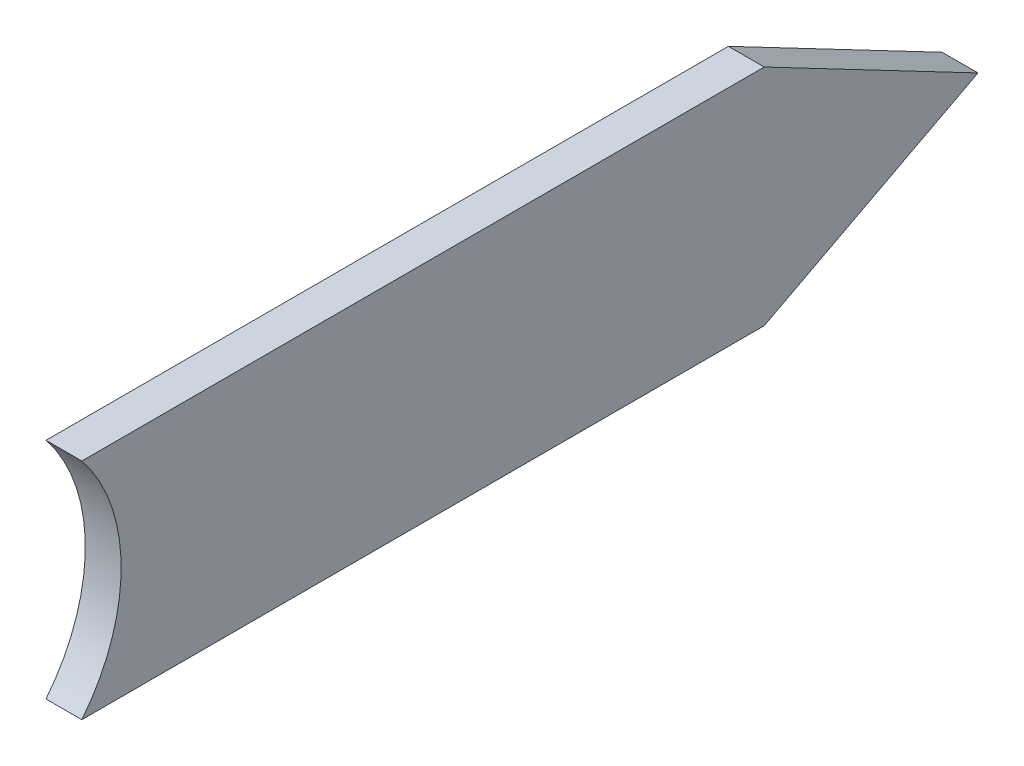
ISO-10303-21;
HEADER;
FILE_DESCRIPTION(('STEP AP214'),'2;1');
FILE_NAME('part.step','',(''),(''),'','','');
FILE_SCHEMA(('AUTOMOTIVE_DESIGN { 1 0 10303 214 1 1 1 1 }'));
ENDSEC;
DATA;
#1=APPLICATION_CONTEXT('core data for automotive mechanical design processes');
#2=APPLICATION_PROTOCOL_DEFINITION('international standard','automotive_design',2000,#1);
#3=PRODUCT_CONTEXT('',#1,'mechanical');
#4=PRODUCT('Part','Part','',(#3));
#5=PRODUCT_RELATED_PRODUCT_CATEGORY('part','',(#4));
#6=PRODUCT_DEFINITION_FORMATION('','',#4);
#7=PRODUCT_DEFINITION_CONTEXT('part definition',#1,'design');
#8=PRODUCT_DEFINITION('design','',#6,#7);
#9=PRODUCT_DEFINITION_SHAPE('','',#8);
#10=(LENGTH_UNIT() NAMED_UNIT(*) SI_UNIT(.MILLI.,.METRE.));
#11=(NAMED_UNIT(*) PLANE_ANGLE_UNIT() SI_UNIT($,.RADIAN.));
#12=(NAMED_UNIT(*) SI_UNIT($,.STERADIAN.) SOLID_ANGLE_UNIT());
#13=UNCERTAINTY_MEASURE_WITH_UNIT(LENGTH_MEASURE(1.E-05),#10,'distance_accuracy_value','');
#14=(GEOMETRIC_REPRESENTATION_CONTEXT(3) GLOBAL_UNCERTAINTY_ASSIGNED_CONTEXT((#13)) GLOBAL_UNIT_ASSIGNED_CONTEXT((#10,
#11,#12)) REPRESENTATION_CONTEXT('',''));
#15=CARTESIAN_POINT('',(0.,0.,0.));
#16=DIRECTION('',(0.,0.,1.));
#17=DIRECTION('',(1.,0.,0.));
#18=AXIS2_PLACEMENT_3D('',#15,#16,#17);
#19=CARTESIAN_POINT('',(8.,0.,131.224989991992));
#20=DIRECTION('',(-1.,0.,0.));
#21=DIRECTION('',(0.,0.,1.));
#22=AXIS2_PLACEMENT_3D('',#19,#20,#21);
#23=CYLINDRICAL_SURFACE('',#22,40.);
#24=CARTESIAN_POINT('',(0.,0.,131.224989991992));
#25=DIRECTION('',(-1.,0.,0.));
#26=DIRECTION('',(0.,0.,1.));
#27=AXIS2_PLACEMENT_3D('',#24,#25,#26);
#28=CIRCLE('',#27,40.);
#29=CARTESIAN_POINT('',(0.,25.,100.));
#30=VERTEX_POINT('',#29);
#31=CARTESIAN_POINT('',(0.,-25.,100.));
#32=VERTEX_POINT('',#31);
#33=EDGE_CURVE('E108',#30,#32,#28,.T.);
#34=ORIENTED_EDGE('',*,*,#33,.T.);
#35=DIRECTION('',(-1.,0.,0.));
#36=VECTOR('',#35,1.);
#37=CARTESIAN_POINT('',(8.,-25.,100.));
#38=LINE('',#37,#36);
#39=CARTESIAN_POINT('',(8.,-25.,100.));
#40=VERTEX_POINT('',#39);
#41=EDGE_CURVE('E11',#40,#32,#38,.T.);
#42=ORIENTED_EDGE('',*,*,#41,.F.);
#43=CARTESIAN_POINT('',(8.,0.,131.224989991992));
#44=DIRECTION('',(-1.,0.,0.));
#45=DIRECTION('',(0.,0.,1.));
#46=AXIS2_PLACEMENT_3D('',#43,#44,#45);
#47=CIRCLE('',#46,40.);
#48=CARTESIAN_POINT('',(8.,25.,100.));
#49=VERTEX_POINT('',#48);
#50=EDGE_CURVE('E116',#49,#40,#47,.T.);
#51=ORIENTED_EDGE('',*,*,#50,.F.);
#52=DIRECTION('',(-1.,0.,0.));
#53=VECTOR('',#52,1.);
#54=CARTESIAN_POINT('',(8.,25.,100.));
#55=LINE('',#54,#53);
#56=EDGE_CURVE('E104',#49,#30,#55,.T.);
#57=ORIENTED_EDGE('',*,*,#56,.T.);
#58=EDGE_LOOP('',(#34,#42,#51,#57));
#59=FACE_BOUND('',#58,.T.);
#60=ADVANCED_FACE('F34',(#59),#23,.F.);
#61=CARTESIAN_POINT('',(8.,-25.,100.));
#62=DIRECTION('',(0.,1.,0.));
#63=DIRECTION('',(0.,0.,1.));
#64=AXIS2_PLACEMENT_3D('',#61,#62,#63);
#65=PLANE('',#64);
#66=DIRECTION('',(0.,0.,-1.));
#67=VECTOR('',#66,1.);
#68=CARTESIAN_POINT('',(0.,-25.,100.));
#69=LINE('',#68,#67);
#70=CARTESIAN_POINT('',(0.,-25.,-52.2935779816514));
#71=VERTEX_POINT('',#70);
#72=EDGE_CURVE('E111',#32,#71,#69,.T.);
#73=ORIENTED_EDGE('',*,*,#72,.T.);
#74=DIRECTION('',(-1.,0.,0.));
#75=VECTOR('',#74,1.);
#76=CARTESIAN_POINT('',(8.,-25.,-52.2935779816514));
#77=LINE('',#76,#75);
#78=CARTESIAN_POINT('',(8.,-25.,-52.2935779816514));
#79=VERTEX_POINT('',#78);
#80=EDGE_CURVE('E42',#79,#71,#77,.T.);
#81=ORIENTED_EDGE('',*,*,#80,.F.);
#82=DIRECTION('',(0.,0.,-1.));
#83=VECTOR('',#82,1.);
#84=CARTESIAN_POINT('',(8.,-25.,100.));
#85=LINE('',#84,#83);
#86=EDGE_CURVE('E84',#40,#79,#85,.T.);
#87=ORIENTED_EDGE('',*,*,#86,.F.);
#88=ORIENTED_EDGE('',*,*,#41,.T.);
#89=EDGE_LOOP('',(#73,#81,#87,#88));
#90=FACE_BOUND('',#89,.T.);
#91=ADVANCED_FACE('F135',(#90),#65,.F.);
#92=CARTESIAN_POINT('',(8.,0.,-99.9999999999997));
#93=DIRECTION('',(0.,0.88574817143102,0.464166109067221));
#94=DIRECTION('',(0.,-0.464166109067221,0.88574817143102));
#95=AXIS2_PLACEMENT_3D('',#92,#93,#94);
#96=PLANE('',#95);
#97=DIRECTION('',(0.,0.464166109067221,-0.88574817143102));
#98=VECTOR('',#97,1.);
#99=CARTESIAN_POINT('',(0.,0.,-99.9999999999997));
#100=LINE('',#99,#98);
#101=CARTESIAN_POINT('',(0.,0.,-99.9999999999997));
#102=VERTEX_POINT('',#101);
#103=EDGE_CURVE('E99',#71,#102,#100,.T.);
#104=ORIENTED_EDGE('',*,*,#103,.T.);
#105=DIRECTION('',(-1.,0.,0.));
#106=VECTOR('',#105,1.);
#107=CARTESIAN_POINT('',(8.,0.,-99.9999999999997));
#108=LINE('',#107,#106);
#109=CARTESIAN_POINT('',(8.,0.,-99.9999999999997));
#110=VERTEX_POINT('',#109);
#111=EDGE_CURVE('E96',#110,#102,#108,.T.);
#112=ORIENTED_EDGE('',*,*,#111,.F.);
#113=DIRECTION('',(0.,0.464166109067221,-0.88574817143102));
#114=VECTOR('',#113,1.);
#115=CARTESIAN_POINT('',(8.,0.,-99.9999999999997));
#116=LINE('',#115,#114);
#117=EDGE_CURVE('E88',#79,#110,#116,.T.);
#118=ORIENTED_EDGE('',*,*,#117,.F.);
#119=ORIENTED_EDGE('',*,*,#80,.T.);
#120=EDGE_LOOP('',(#104,#112,#118,#119));
#121=FACE_BOUND('',#120,.T.);
#122=ADVANCED_FACE('F97',(#121),#96,.F.);
#123=CARTESIAN_POINT('',(8.,0.,-99.9999999999997));
#124=DIRECTION('',(0.,-0.885748171431022,0.464166109067219));
#125=DIRECTION('',(0.,-0.464166109067219,-0.885748171431022));
#126=AXIS2_PLACEMENT_3D('',#123,#124,#125);
#127=PLANE('',#126);
#128=DIRECTION('',(0.,0.464166109067219,0.885748171431021));
#129=VECTOR('',#128,1.);
#130=CARTESIAN_POINT('',(0.,0.,-99.9999999999997));
#131=LINE('',#130,#129);
#132=CARTESIAN_POINT('',(0.,25.,-52.2935779816514));
#133=VERTEX_POINT('',#132);
#134=EDGE_CURVE('E70',#102,#133,#131,.T.);
#135=ORIENTED_EDGE('',*,*,#134,.T.);
#136=DIRECTION('',(-1.,0.,0.));
#137=VECTOR('',#136,1.);
#138=CARTESIAN_POINT('',(8.,25.,-52.2935779816514));
#139=LINE('',#138,#137);
#140=CARTESIAN_POINT('',(8.,25.,-52.2935779816514));
#141=VERTEX_POINT('',#140);
#142=EDGE_CURVE('E100',#141,#133,#139,.T.);
#143=ORIENTED_EDGE('',*,*,#142,.F.);
#144=DIRECTION('',(0.,0.464166109067219,0.885748171431021));
#145=VECTOR('',#144,1.);
#146=CARTESIAN_POINT('',(8.,0.,-99.9999999999997));
#147=LINE('',#146,#145);
#148=EDGE_CURVE('E92',#110,#141,#147,.T.);
#149=ORIENTED_EDGE('',*,*,#148,.F.);
#150=ORIENTED_EDGE('',*,*,#111,.T.);
#151=EDGE_LOOP('',(#135,#143,#149,#150));
#152=FACE_BOUND('',#151,.T.);
#153=ADVANCED_FACE('F102',(#152),#127,.F.);
#154=CARTESIAN_POINT('',(8.,25.,100.));
#155=DIRECTION('',(0.,-1.,0.));
#156=DIRECTION('',(0.,0.,-1.));
#157=AXIS2_PLACEMENT_3D('',#154,#155,#156);
#158=PLANE('',#157);
#159=DIRECTION('',(0.,0.,1.));
#160=VECTOR('',#159,1.);
#161=CARTESIAN_POINT('',(0.,25.,100.));
#162=LINE('',#161,#160);
#163=EDGE_CURVE('E76',#133,#30,#162,.T.);
#164=ORIENTED_EDGE('',*,*,#163,.T.);
#165=ORIENTED_EDGE('',*,*,#56,.F.);
#166=DIRECTION('',(0.,0.,1.));
#167=VECTOR('',#166,1.);
#168=CARTESIAN_POINT('',(8.,25.,100.));
#169=LINE('',#168,#167);
#170=EDGE_CURVE('E50',#141,#49,#169,.T.);
#171=ORIENTED_EDGE('',*,*,#170,.F.);
#172=ORIENTED_EDGE('',*,*,#142,.T.);
#173=EDGE_LOOP('',(#164,#165,#171,#172));
#174=FACE_BOUND('',#173,.T.);
#175=ADVANCED_FACE('F124',(#174),#158,.F.);
#176=CARTESIAN_POINT('',(8.,0.,131.224989991992));
#177=DIRECTION('',(-1.,0.,0.));
#178=DIRECTION('',(0.,0.,1.));
#179=AXIS2_PLACEMENT_3D('',#176,#177,#178);
#180=PLANE('',#179);
#181=ORIENTED_EDGE('',*,*,#50,.T.);
#182=ORIENTED_EDGE('',*,*,#86,.T.);
#183=ORIENTED_EDGE('',*,*,#117,.T.);
#184=ORIENTED_EDGE('',*,*,#148,.T.);
#185=ORIENTED_EDGE('',*,*,#170,.T.);
#186=EDGE_LOOP('',(#181,#182,#183,#184,#185));
#187=FACE_BOUND('',#186,.T.);
#188=ADVANCED_FACE('F90',(#187),#180,.F.);
#189=CARTESIAN_POINT('',(0.,0.,131.224989991992));
#190=DIRECTION('',(-1.,0.,0.));
#191=DIRECTION('',(0.,0.,1.));
#192=AXIS2_PLACEMENT_3D('',#189,#190,#191);
#193=PLANE('',#192);
#194=ORIENTED_EDGE('',*,*,#33,.F.);
#195=ORIENTED_EDGE('',*,*,#163,.F.);
#196=ORIENTED_EDGE('',*,*,#134,.F.);
#197=ORIENTED_EDGE('',*,*,#103,.F.);
#198=ORIENTED_EDGE('',*,*,#72,.F.);
#199=EDGE_LOOP('',(#194,#195,#196,#197,#198));
#200=FACE_BOUND('',#199,.T.);
#201=ADVANCED_FACE('F120',(#200),#193,.T.);
#202=CLOSED_SHELL('',(#60,#91,#122,#153,#175,#188,#201));
#203=MANIFOLD_SOLID_BREP('B2',#202);
#204=ADVANCED_BREP_SHAPE_REPRESENTATION('',(#18,#203),#14);
#205=SHAPE_DEFINITION_REPRESENTATION(#9,#204);
ENDSEC;
END-ISO-10303-21;
